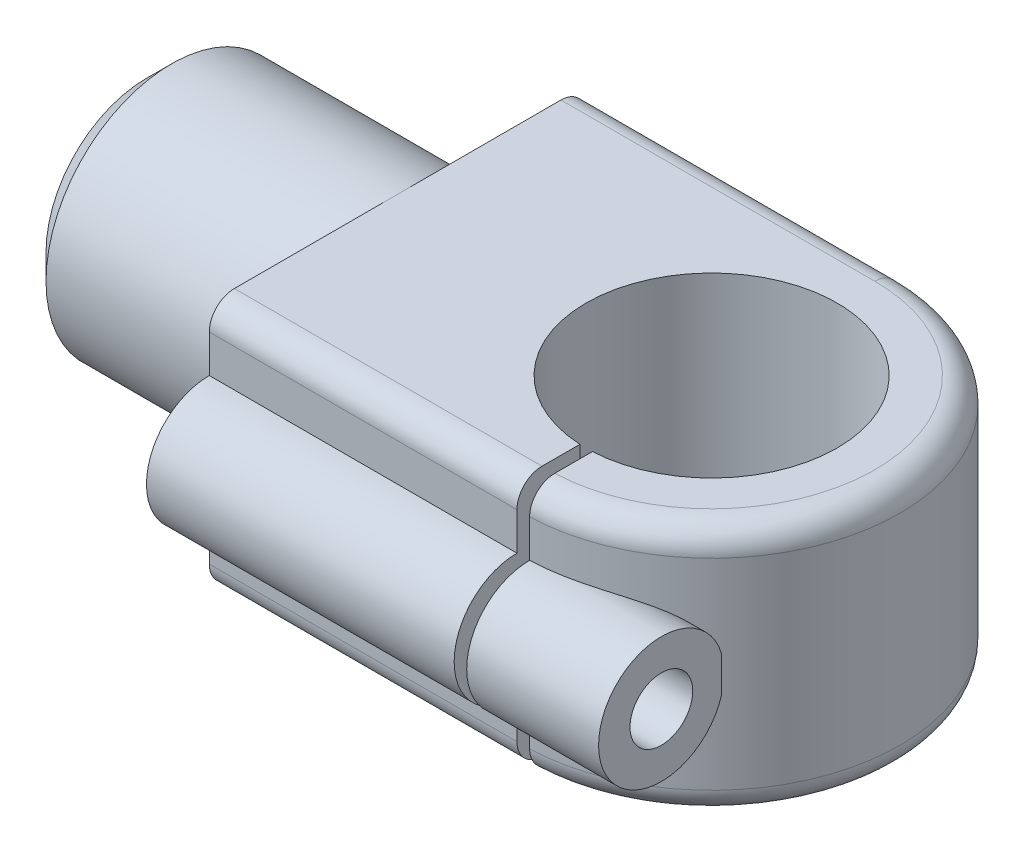
ISO-10303-21;
HEADER;
FILE_DESCRIPTION(('STEP AP214'),'2;1');
FILE_NAME('part.step','',(''),(''),'','','');
FILE_SCHEMA(('AUTOMOTIVE_DESIGN { 1 0 10303 214 1 1 1 1 }'));
ENDSEC;
DATA;
#1=APPLICATION_CONTEXT('core data for automotive mechanical design processes');
#2=APPLICATION_PROTOCOL_DEFINITION('international standard','automotive_design',2000,#1);
#3=PRODUCT_CONTEXT('',#1,'mechanical');
#4=PRODUCT('Part','Part','',(#3));
#5=PRODUCT_RELATED_PRODUCT_CATEGORY('part','',(#4));
#6=PRODUCT_DEFINITION_FORMATION('','',#4);
#7=PRODUCT_DEFINITION_CONTEXT('part definition',#1,'design');
#8=PRODUCT_DEFINITION('design','',#6,#7);
#9=PRODUCT_DEFINITION_SHAPE('','',#8);
#10=(LENGTH_UNIT() NAMED_UNIT(*) SI_UNIT(.MILLI.,.METRE.));
#11=(NAMED_UNIT(*) PLANE_ANGLE_UNIT() SI_UNIT($,.RADIAN.));
#12=(NAMED_UNIT(*) SI_UNIT($,.STERADIAN.) SOLID_ANGLE_UNIT());
#13=UNCERTAINTY_MEASURE_WITH_UNIT(LENGTH_MEASURE(1.E-05),#10,'distance_accuracy_value','');
#14=(GEOMETRIC_REPRESENTATION_CONTEXT(3) GLOBAL_UNCERTAINTY_ASSIGNED_CONTEXT((#13)) GLOBAL_UNIT_ASSIGNED_CONTEXT((#10,
#11,#12)) REPRESENTATION_CONTEXT('',''));
#15=CARTESIAN_POINT('',(0.,0.,0.));
#16=DIRECTION('',(0.,0.,1.));
#17=DIRECTION('',(1.,0.,0.));
#18=AXIS2_PLACEMENT_3D('',#15,#16,#17);
#19=CARTESIAN_POINT('',(0.,20.,0.));
#20=DIRECTION('',(0.,1.,0.));
#21=DIRECTION('',(0.,0.,1.));
#22=AXIS2_PLACEMENT_3D('',#19,#20,#21);
#23=PLANE('',#22);
#24=DIRECTION('',(0.,0.,-1.));
#25=VECTOR('',#24,1.);
#26=CARTESIAN_POINT('',(-25.,20.,0.));
#27=LINE('',#26,#25);
#28=CARTESIAN_POINT('',(-25.,20.,0.));
#29=VERTEX_POINT('',#28);
#30=CARTESIAN_POINT('',(-25.,20.,-13.));
#31=VERTEX_POINT('',#30);
#32=EDGE_CURVE('E193',#29,#31,#27,.T.);
#33=ORIENTED_EDGE('',*,*,#32,.F.);
#34=DIRECTION('',(0.,0.,-1.));
#35=VECTOR('',#34,1.);
#36=CARTESIAN_POINT('',(-25.,20.,0.));
#37=LINE('',#36,#35);
#38=CARTESIAN_POINT('',(-25.,20.,13.));
#39=VERTEX_POINT('',#38);
#40=EDGE_CURVE('E177',#39,#29,#37,.T.);
#41=ORIENTED_EDGE('',*,*,#40,.F.);
#42=DIRECTION('',(1.,0.,0.));
#43=VECTOR('',#42,1.);
#44=CARTESIAN_POINT('',(-0.5,20.,13.));
#45=LINE('',#44,#43);
#46=CARTESIAN_POINT('',(-0.5,20.,13.));
#47=VERTEX_POINT('',#46);
#48=EDGE_CURVE('E340',#39,#47,#45,.T.);
#49=ORIENTED_EDGE('',*,*,#48,.T.);
#50=DIRECTION('',(0.,0.,-1.));
#51=VECTOR('',#50,1.);
#52=CARTESIAN_POINT('',(-0.5,20.,0.));
#53=LINE('',#52,#51);
#54=CARTESIAN_POINT('',(-0.5,20.,9.98749217771909));
#55=VERTEX_POINT('',#54);
#56=EDGE_CURVE('E395',#47,#55,#53,.T.);
#57=ORIENTED_EDGE('',*,*,#56,.T.);
#58=CARTESIAN_POINT('',(0.,20.,0.));
#59=DIRECTION('',(0.,1.,0.));
#60=DIRECTION('',(0.,0.,1.));
#61=AXIS2_PLACEMENT_3D('',#58,#59,#60);
#62=CIRCLE('',#61,10.);
#63=CARTESIAN_POINT('',(0.5,20.,9.98749217771909));
#64=VERTEX_POINT('',#63);
#65=EDGE_CURVE('E396',#64,#55,#62,.T.);
#66=ORIENTED_EDGE('',*,*,#65,.F.);
#67=DIRECTION('',(0.,0.,-1.));
#68=VECTOR('',#67,1.);
#69=CARTESIAN_POINT('',(0.5,20.,0.));
#70=LINE('',#69,#68);
#71=CARTESIAN_POINT('',(0.5,20.,12.9903810567666));
#72=VERTEX_POINT('',#71);
#73=EDGE_CURVE('E397',#72,#64,#70,.T.);
#74=ORIENTED_EDGE('',*,*,#73,.F.);
#75=CARTESIAN_POINT('',(0.,20.,0.));
#76=DIRECTION('',(0.,1.,0.));
#77=DIRECTION('',(0.,0.,1.));
#78=AXIS2_PLACEMENT_3D('',#75,#76,#77);
#79=CIRCLE('',#78,13.);
#80=CARTESIAN_POINT('',(0.,20.,-13.));
#81=VERTEX_POINT('',#80);
#82=EDGE_CURVE('E335',#72,#81,#79,.T.);
#83=ORIENTED_EDGE('',*,*,#82,.T.);
#84=DIRECTION('',(-1.,0.,0.));
#85=VECTOR('',#84,1.);
#86=CARTESIAN_POINT('',(-30.,20.,-13.));
#87=LINE('',#86,#85);
#88=EDGE_CURVE('E203',#81,#31,#87,.T.);
#89=ORIENTED_EDGE('',*,*,#88,.T.);
#90=EDGE_LOOP('',(#33,#41,#49,#57,#66,#74,#83,#89));
#91=FACE_BOUND('',#90,.T.);
#92=ADVANCED_FACE('F50',(#91),#23,.T.);
#93=CARTESIAN_POINT('',(0.,0.,0.));
#94=DIRECTION('',(0.,1.,0.));
#95=DIRECTION('',(0.,0.,1.));
#96=AXIS2_PLACEMENT_3D('',#93,#94,#95);
#97=PLANE('',#96);
#98=DIRECTION('',(0.,0.,1.));
#99=VECTOR('',#98,1.);
#100=CARTESIAN_POINT('',(-25.,0.,0.));
#101=LINE('',#100,#99);
#102=CARTESIAN_POINT('',(-25.,0.,0.));
#103=VERTEX_POINT('',#102);
#104=CARTESIAN_POINT('',(-25.,0.,13.));
#105=VERTEX_POINT('',#104);
#106=EDGE_CURVE('E178',#103,#105,#101,.T.);
#107=ORIENTED_EDGE('',*,*,#106,.F.);
#108=DIRECTION('',(0.,0.,1.));
#109=VECTOR('',#108,1.);
#110=CARTESIAN_POINT('',(-25.,0.,0.));
#111=LINE('',#110,#109);
#112=CARTESIAN_POINT('',(-25.,0.,-13.));
#113=VERTEX_POINT('',#112);
#114=EDGE_CURVE('E198',#113,#103,#111,.T.);
#115=ORIENTED_EDGE('',*,*,#114,.F.);
#116=DIRECTION('',(-1.,0.,0.));
#117=VECTOR('',#116,1.);
#118=CARTESIAN_POINT('',(0.,0.,-13.));
#119=LINE('',#118,#117);
#120=CARTESIAN_POINT('',(0.,0.,-13.));
#121=VERTEX_POINT('',#120);
#122=EDGE_CURVE('E324',#113,#121,#119,.F.);
#123=ORIENTED_EDGE('',*,*,#122,.T.);
#124=CARTESIAN_POINT('',(0.,0.,0.));
#125=DIRECTION('',(0.,1.,0.));
#126=DIRECTION('',(0.,0.,1.));
#127=AXIS2_PLACEMENT_3D('',#124,#125,#126);
#128=CIRCLE('',#127,13.);
#129=CARTESIAN_POINT('',(0.5,0.,12.9903810567666));
#130=VERTEX_POINT('',#129);
#131=EDGE_CURVE('E320',#121,#130,#128,.F.);
#132=ORIENTED_EDGE('',*,*,#131,.T.);
#133=DIRECTION('',(0.,0.,-1.));
#134=VECTOR('',#133,1.);
#135=CARTESIAN_POINT('',(0.5,0.,0.));
#136=LINE('',#135,#134);
#137=CARTESIAN_POINT('',(0.5,0.,9.98749217771909));
#138=VERTEX_POINT('',#137);
#139=EDGE_CURVE('E416',#130,#138,#136,.T.);
#140=ORIENTED_EDGE('',*,*,#139,.T.);
#141=CARTESIAN_POINT('',(0.,0.,0.));
#142=DIRECTION('',(0.,1.,0.));
#143=DIRECTION('',(0.,0.,1.));
#144=AXIS2_PLACEMENT_3D('',#141,#142,#143);
#145=CIRCLE('',#144,10.);
#146=CARTESIAN_POINT('',(-0.5,0.,9.98749217771909));
#147=VERTEX_POINT('',#146);
#148=EDGE_CURVE('E421',#138,#147,#145,.T.);
#149=ORIENTED_EDGE('',*,*,#148,.T.);
#150=DIRECTION('',(0.,0.,-1.));
#151=VECTOR('',#150,1.);
#152=CARTESIAN_POINT('',(-0.5,0.,0.));
#153=LINE('',#152,#151);
#154=CARTESIAN_POINT('',(-0.5,0.,13.));
#155=VERTEX_POINT('',#154);
#156=EDGE_CURVE('E404',#155,#147,#153,.T.);
#157=ORIENTED_EDGE('',*,*,#156,.F.);
#158=DIRECTION('',(1.,0.,0.));
#159=VECTOR('',#158,1.);
#160=CARTESIAN_POINT('',(0.,0.,13.));
#161=LINE('',#160,#159);
#162=EDGE_CURVE('E327',#155,#105,#161,.F.);
#163=ORIENTED_EDGE('',*,*,#162,.T.);
#164=EDGE_LOOP('',(#107,#115,#123,#132,#140,#149,#157,#163));
#165=FACE_BOUND('',#164,.T.);
#166=ADVANCED_FACE('F270',(#165),#97,.F.);
#167=CARTESIAN_POINT('',(11.,10.,15.));
#168=DIRECTION('',(-1.,0.,0.));
#169=DIRECTION('',(0.,0.,1.));
#170=AXIS2_PLACEMENT_3D('',#167,#168,#169);
#171=CYLINDRICAL_SURFACE('',#170,5.);
#172=DIRECTION('',(-1.,0.,0.));
#173=VECTOR('',#172,1.);
#174=CARTESIAN_POINT('',(11.,15.,15.));
#175=LINE('',#174,#173);
#176=CARTESIAN_POINT('',(-25.,15.,15.));
#177=VERTEX_POINT('',#176);
#178=CARTESIAN_POINT('',(-0.5,15.,15.));
#179=VERTEX_POINT('',#178);
#180=EDGE_CURVE('E230',#177,#179,#175,.F.);
#181=ORIENTED_EDGE('',*,*,#180,.F.);
#182=CARTESIAN_POINT('',(-25.,10.,15.));
#183=DIRECTION('',(-1.,0.,0.));
#184=DIRECTION('',(0.,0.,1.));
#185=AXIS2_PLACEMENT_3D('',#182,#183,#184);
#186=CIRCLE('',#185,5.);
#187=CARTESIAN_POINT('',(-25.,5.,15.));
#188=VERTEX_POINT('',#187);
#189=EDGE_CURVE('E503',#188,#177,#186,.T.);
#190=ORIENTED_EDGE('',*,*,#189,.F.);
#191=DIRECTION('',(-1.,0.,0.));
#192=VECTOR('',#191,1.);
#193=CARTESIAN_POINT('',(11.,5.,15.));
#194=LINE('',#193,#192);
#195=CARTESIAN_POINT('',(-0.5,5.,15.));
#196=VERTEX_POINT('',#195);
#197=EDGE_CURVE('E227',#196,#188,#194,.T.);
#198=ORIENTED_EDGE('',*,*,#197,.F.);
#199=CARTESIAN_POINT('',(-0.5,10.,15.));
#200=DIRECTION('',(-1.,0.,0.));
#201=DIRECTION('',(0.,0.,1.));
#202=AXIS2_PLACEMENT_3D('',#199,#200,#201);
#203=CIRCLE('',#202,5.);
#204=EDGE_CURVE('E311',#179,#196,#203,.F.);
#205=ORIENTED_EDGE('',*,*,#204,.F.);
#206=EDGE_LOOP('',(#181,#190,#198,#205));
#207=FACE_BOUND('',#206,.T.);
#208=ADVANCED_FACE('F265',(#207),#171,.T.);
#209=CARTESIAN_POINT('',(0.,20.,15.));
#210=DIRECTION('',(0.,0.,-1.));
#211=DIRECTION('',(-1.,0.,0.));
#212=AXIS2_PLACEMENT_3D('',#209,#210,#211);
#213=PLANE('',#212);
#214=DIRECTION('',(0.,1.,0.));
#215=VECTOR('',#214,1.);
#216=CARTESIAN_POINT('',(-25.,0.,15.));
#217=LINE('',#216,#215);
#218=CARTESIAN_POINT('',(-25.,2.,15.));
#219=VERTEX_POINT('',#218);
#220=EDGE_CURVE('E504',#219,#188,#217,.T.);
#221=ORIENTED_EDGE('',*,*,#220,.F.);
#222=DIRECTION('',(1.,0.,0.));
#223=VECTOR('',#222,1.);
#224=CARTESIAN_POINT('',(0.,2.,15.));
#225=LINE('',#224,#223);
#226=CARTESIAN_POINT('',(-0.5,2.,15.));
#227=VERTEX_POINT('',#226);
#228=EDGE_CURVE('E348',#219,#227,#225,.T.);
#229=ORIENTED_EDGE('',*,*,#228,.T.);
#230=DIRECTION('',(0.,-1.,0.));
#231=VECTOR('',#230,1.);
#232=CARTESIAN_POINT('',(-0.5,20.,15.));
#233=LINE('',#232,#231);
#234=EDGE_CURVE('E406',#196,#227,#233,.T.);
#235=ORIENTED_EDGE('',*,*,#234,.F.);
#236=ORIENTED_EDGE('',*,*,#197,.T.);
#237=EDGE_LOOP('',(#221,#229,#235,#236));
#238=FACE_BOUND('',#237,.T.);
#239=ADVANCED_FACE('F276',(#238),#213,.F.);
#240=DIRECTION('',(0.,1.,0.));
#241=VECTOR('',#240,1.);
#242=CARTESIAN_POINT('',(-25.,0.,15.));
#243=LINE('',#242,#241);
#244=CARTESIAN_POINT('',(-25.,18.,15.));
#245=VERTEX_POINT('',#244);
#246=EDGE_CURVE('E499',#177,#245,#243,.T.);
#247=ORIENTED_EDGE('',*,*,#246,.F.);
#248=ORIENTED_EDGE('',*,*,#180,.T.);
#249=CARTESIAN_POINT('',(-0.5,18.,15.));
#250=VERTEX_POINT('',#249);
#251=EDGE_CURVE('E426',#250,#179,#233,.T.);
#252=ORIENTED_EDGE('',*,*,#251,.F.);
#253=DIRECTION('',(1.,0.,0.));
#254=VECTOR('',#253,1.);
#255=CARTESIAN_POINT('',(-30.,18.,15.));
#256=LINE('',#255,#254);
#257=EDGE_CURVE('E347',#250,#245,#256,.F.);
#258=ORIENTED_EDGE('',*,*,#257,.T.);
#259=EDGE_LOOP('',(#247,#248,#252,#258));
#260=FACE_BOUND('',#259,.T.);
#261=ADVANCED_FACE('F283',(#260),#213,.F.);
#262=CARTESIAN_POINT('',(-30.,10.,15.));
#263=DIRECTION('',(1.,0.,0.));
#264=DIRECTION('',(0.,0.,-1.));
#265=AXIS2_PLACEMENT_3D('',#262,#263,#264);
#266=CYLINDRICAL_SURFACE('',#265,2.5);
#267=CARTESIAN_POINT('',(-0.5,10.,15.));
#268=DIRECTION('',(-1.,0.,0.));
#269=DIRECTION('',(0.,0.,1.));
#270=AXIS2_PLACEMENT_3D('',#267,#268,#269);
#271=CIRCLE('',#270,2.5);
#272=CARTESIAN_POINT('',(-0.5,10.,17.5));
#273=VERTEX_POINT('',#272);
#274=EDGE_CURVE('E212',#273,#273,#271,.T.);
#275=ORIENTED_EDGE('',*,*,#274,.F.);
#276=EDGE_LOOP('',(#275));
#277=FACE_BOUND('',#276,.T.);
#278=CARTESIAN_POINT('',(-25.,10.,15.));
#279=DIRECTION('',(-1.,0.,0.));
#280=DIRECTION('',(0.,0.,1.));
#281=AXIS2_PLACEMENT_3D('',#278,#279,#280);
#282=CIRCLE('',#281,2.5);
#283=CARTESIAN_POINT('',(-25.,10.,17.5));
#284=VERTEX_POINT('',#283);
#285=EDGE_CURVE('E189',#284,#284,#282,.F.);
#286=ORIENTED_EDGE('',*,*,#285,.F.);
#287=EDGE_LOOP('',(#286));
#288=FACE_BOUND('',#287,.T.);
#289=ADVANCED_FACE('F385',(#277,#288),#266,.F.);
#290=CARTESIAN_POINT('',(0.,18.,13.));
#291=DIRECTION('',(-1.,0.,0.));
#292=DIRECTION('',(0.,0.,1.));
#293=AXIS2_PLACEMENT_3D('',#290,#291,#292);
#294=CYLINDRICAL_SURFACE('',#293,2.);
#295=ORIENTED_EDGE('',*,*,#48,.F.);
#296=CARTESIAN_POINT('',(-25.,18.,13.));
#297=DIRECTION('',(-1.,0.,0.));
#298=DIRECTION('',(0.,0.,1.));
#299=AXIS2_PLACEMENT_3D('',#296,#297,#298);
#300=CIRCLE('',#299,2.);
#301=EDGE_CURVE('E184',#245,#39,#300,.T.);
#302=ORIENTED_EDGE('',*,*,#301,.F.);
#303=ORIENTED_EDGE('',*,*,#257,.F.);
#304=CARTESIAN_POINT('',(-0.5,18.,13.));
#305=DIRECTION('',(-1.,0.,0.));
#306=DIRECTION('',(0.,0.,1.));
#307=AXIS2_PLACEMENT_3D('',#304,#305,#306);
#308=CIRCLE('',#307,2.);
#309=EDGE_CURVE('E343',#47,#250,#308,.F.);
#310=ORIENTED_EDGE('',*,*,#309,.F.);
#311=EDGE_LOOP('',(#295,#302,#303,#310));
#312=FACE_BOUND('',#311,.T.);
#313=ADVANCED_FACE('F293',(#312),#294,.T.);
#314=CARTESIAN_POINT('',(0.,2.,13.));
#315=DIRECTION('',(1.,0.,0.));
#316=DIRECTION('',(0.,0.,-1.));
#317=AXIS2_PLACEMENT_3D('',#314,#315,#316);
#318=CYLINDRICAL_SURFACE('',#317,2.);
#319=ORIENTED_EDGE('',*,*,#228,.F.);
#320=CARTESIAN_POINT('',(-25.,2.,13.));
#321=DIRECTION('',(-1.,0.,0.));
#322=DIRECTION('',(0.,0.,1.));
#323=AXIS2_PLACEMENT_3D('',#320,#321,#322);
#324=CIRCLE('',#323,2.);
#325=EDGE_CURVE('E510',#105,#219,#324,.T.);
#326=ORIENTED_EDGE('',*,*,#325,.F.);
#327=ORIENTED_EDGE('',*,*,#162,.F.);
#328=CARTESIAN_POINT('',(-0.5,2.,13.));
#329=DIRECTION('',(-1.,0.,0.));
#330=DIRECTION('',(0.,0.,1.));
#331=AXIS2_PLACEMENT_3D('',#328,#329,#330);
#332=CIRCLE('',#331,2.);
#333=EDGE_CURVE('E337',#227,#155,#332,.F.);
#334=ORIENTED_EDGE('',*,*,#333,.F.);
#335=EDGE_LOOP('',(#319,#326,#327,#334));
#336=FACE_BOUND('',#335,.T.);
#337=ADVANCED_FACE('F286',(#336),#318,.T.);
#338=CARTESIAN_POINT('',(0.,20.,-15.));
#339=DIRECTION('',(0.,0.,1.));
#340=DIRECTION('',(1.,0.,0.));
#341=AXIS2_PLACEMENT_3D('',#338,#339,#340);
#342=PLANE('',#341);
#343=DIRECTION('',(0.,-1.,0.));
#344=VECTOR('',#343,1.);
#345=CARTESIAN_POINT('',(-25.,0.,-15.));
#346=LINE('',#345,#344);
#347=CARTESIAN_POINT('',(-25.,18.,-15.));
#348=VERTEX_POINT('',#347);
#349=CARTESIAN_POINT('',(-25.,2.,-15.));
#350=VERTEX_POINT('',#349);
#351=EDGE_CURVE('E299',#348,#350,#346,.T.);
#352=ORIENTED_EDGE('',*,*,#351,.F.);
#353=DIRECTION('',(-1.,0.,0.));
#354=VECTOR('',#353,1.);
#355=CARTESIAN_POINT('',(0.,18.,-15.));
#356=LINE('',#355,#354);
#357=CARTESIAN_POINT('',(0.,18.,-15.));
#358=VERTEX_POINT('',#357);
#359=EDGE_CURVE('E305',#348,#358,#356,.F.);
#360=ORIENTED_EDGE('',*,*,#359,.T.);
#361=DIRECTION('',(0.,-1.,0.));
#362=VECTOR('',#361,1.);
#363=CARTESIAN_POINT('',(0.,20.,-15.));
#364=LINE('',#363,#362);
#365=CARTESIAN_POINT('',(0.,2.,-15.));
#366=VERTEX_POINT('',#365);
#367=EDGE_CURVE('E429',#358,#366,#364,.T.);
#368=ORIENTED_EDGE('',*,*,#367,.T.);
#369=DIRECTION('',(-1.,0.,0.));
#370=VECTOR('',#369,1.);
#371=CARTESIAN_POINT('',(0.,2.,-15.));
#372=LINE('',#371,#370);
#373=EDGE_CURVE('E302',#366,#350,#372,.T.);
#374=ORIENTED_EDGE('',*,*,#373,.T.);
#375=EDGE_LOOP('',(#352,#360,#368,#374));
#376=FACE_BOUND('',#375,.T.);
#377=ADVANCED_FACE('F281',(#376),#342,.F.);
#378=CARTESIAN_POINT('',(0.,2.,-13.));
#379=DIRECTION('',(-1.,0.,0.));
#380=DIRECTION('',(0.,0.,1.));
#381=AXIS2_PLACEMENT_3D('',#378,#379,#380);
#382=CYLINDRICAL_SURFACE('',#381,2.);
#383=ORIENTED_EDGE('',*,*,#122,.F.);
#384=CARTESIAN_POINT('',(-25.,2.,-13.));
#385=DIRECTION('',(-1.,0.,0.));
#386=DIRECTION('',(0.,0.,1.));
#387=AXIS2_PLACEMENT_3D('',#384,#385,#386);
#388=CIRCLE('',#387,2.);
#389=EDGE_CURVE('E307',#350,#113,#388,.T.);
#390=ORIENTED_EDGE('',*,*,#389,.F.);
#391=ORIENTED_EDGE('',*,*,#373,.F.);
#392=CARTESIAN_POINT('',(0.,2.,-13.));
#393=DIRECTION('',(-1.,0.,0.));
#394=DIRECTION('',(0.,-1.,0.));
#395=AXIS2_PLACEMENT_3D('',#392,#393,#394);
#396=CIRCLE('',#395,2.);
#397=EDGE_CURVE('E214',#366,#121,#396,.T.);
#398=ORIENTED_EDGE('',*,*,#397,.T.);
#399=EDGE_LOOP('',(#383,#390,#391,#398));
#400=FACE_BOUND('',#399,.T.);
#401=ADVANCED_FACE('F282',(#400),#382,.T.);
#402=CARTESIAN_POINT('',(0.,18.,-13.));
#403=DIRECTION('',(1.,0.,0.));
#404=DIRECTION('',(0.,0.,-1.));
#405=AXIS2_PLACEMENT_3D('',#402,#403,#404);
#406=CYLINDRICAL_SURFACE('',#405,2.);
#407=ORIENTED_EDGE('',*,*,#359,.F.);
#408=CARTESIAN_POINT('',(-25.,18.,-13.));
#409=DIRECTION('',(-1.,0.,0.));
#410=DIRECTION('',(0.,0.,1.));
#411=AXIS2_PLACEMENT_3D('',#408,#409,#410);
#412=CIRCLE('',#411,2.);
#413=EDGE_CURVE('E201',#31,#348,#412,.T.);
#414=ORIENTED_EDGE('',*,*,#413,.F.);
#415=ORIENTED_EDGE('',*,*,#88,.F.);
#416=CARTESIAN_POINT('',(0.,18.,-13.));
#417=DIRECTION('',(-1.,0.,0.));
#418=DIRECTION('',(0.,0.,1.));
#419=AXIS2_PLACEMENT_3D('',#416,#417,#418);
#420=CIRCLE('',#419,2.);
#421=EDGE_CURVE('E206',#81,#358,#420,.T.);
#422=ORIENTED_EDGE('',*,*,#421,.T.);
#423=EDGE_LOOP('',(#407,#414,#415,#422));
#424=FACE_BOUND('',#423,.T.);
#425=ADVANCED_FACE('F295',(#424),#406,.T.);
#426=CARTESIAN_POINT('',(0.5,20.,0.));
#427=DIRECTION('',(-1.,0.,0.));
#428=DIRECTION('',(0.,0.,1.));
#429=AXIS2_PLACEMENT_3D('',#426,#427,#428);
#430=PLANE('',#429);
#431=CARTESIAN_POINT('',(0.5,10.,15.));
#432=DIRECTION('',(-1.,0.,0.));
#433=DIRECTION('',(0.,0.,1.));
#434=AXIS2_PLACEMENT_3D('',#431,#432,#433);
#435=CIRCLE('',#434,2.5);
#436=CARTESIAN_POINT('',(0.5,10.,17.5));
#437=VERTEX_POINT('',#436);
#438=EDGE_CURVE('E218',#437,#437,#435,.T.);
#439=ORIENTED_EDGE('',*,*,#438,.F.);
#440=EDGE_LOOP('',(#439));
#441=FACE_BOUND('',#440,.T.);
#442=ORIENTED_EDGE('',*,*,#139,.F.);
#443=CARTESIAN_POINT('',(0.5,0.,12.9903810567666));
#444=CARTESIAN_POINT('',(0.5,3.9474154008824E-07,13.0467150452053));
#445=CARTESIAN_POINT('',(0.5,0.00237810851266362,13.103022076195));
#446=CARTESIAN_POINT('',(0.5,0.0118641897622879,13.215233562011));
#447=CARTESIAN_POINT('',(0.5,0.0189723412082146,13.2711380351036));
#448=CARTESIAN_POINT('',(0.5,0.0473260310628624,13.4375517851217));
#449=CARTESIAN_POINT('',(0.5,0.0756009864726571,13.5469468675122));
#450=CARTESIAN_POINT('',(0.5,0.150116828889387,13.759434911907));
#451=CARTESIAN_POINT('',(0.5,0.196366540729273,13.8625247494893));
#452=CARTESIAN_POINT('',(0.5,0.305518473808404,14.0594686849897));
#453=CARTESIAN_POINT('',(0.5,0.36841763608513,14.1533244751162));
#454=CARTESIAN_POINT('',(0.5,0.5090593195644,14.329096210817));
#455=CARTESIAN_POINT('',(0.5,0.586795865286165,14.4110169396758));
#456=CARTESIAN_POINT('',(0.5,0.754945090825614,14.5606526498705));
#457=CARTESIAN_POINT('',(0.5,0.845360238454905,14.6283648591851));
#458=CARTESIAN_POINT('',(0.5,1.03623337964804,14.7476054138702));
#459=CARTESIAN_POINT('',(0.5,1.13668716525642,14.7991405030972));
#460=CARTESIAN_POINT('',(0.5,1.34480385558574,14.8845781561183));
#461=CARTESIAN_POINT('',(0.5,1.45246243486213,14.9184911941124));
#462=CARTESIAN_POINT('',(0.5,1.63398864538022,14.9592514641663));
#463=CARTESIAN_POINT('',(0.5,1.70671025517,14.9713989770526));
#464=CARTESIAN_POINT('',(0.5,1.85294436952205,14.9876043045346));
#465=CARTESIAN_POINT('',(0.5,1.92645560245249,14.9916735975551));
#466=CARTESIAN_POINT('',(0.5,2.,14.9916643505649));
#467=B_SPLINE_CURVE_WITH_KNOTS('',3,(#443,#444,#445,#446,#447,#448,#449,#450,#451,#452,#453,
#454,#455,#456,#457,#458,#459,#460,#461,#462,#463,#464,#465,#466),.UNSPECIFIED.,.F.,.F.,(4,2,2,
2,2,2,2,2,2,2,2,4),(0.,0.168898237005139,0.337788761189665,0.675020464450288,1.01241794356334,
1.34975347644329,1.6869534392658,2.02421912732002,2.36134403003656,2.69826832248159,
2.91903835864936,3.13949447525757),.UNSPECIFIED.);
#468=CARTESIAN_POINT('',(0.5,2.,14.9916643505649));
#469=VERTEX_POINT('',#468);
#470=EDGE_CURVE('E61',#130,#469,#467,.T.);
#471=ORIENTED_EDGE('',*,*,#470,.T.);
#472=DIRECTION('',(0.,-1.,0.));
#473=VECTOR('',#472,1.);
#474=CARTESIAN_POINT('',(0.5,20.,14.9916643505649));
#475=LINE('',#474,#473);
#476=CARTESIAN_POINT('',(0.5,5.00000694830998,14.9916643505649));
#477=VERTEX_POINT('',#476);
#478=EDGE_CURVE('E433',#477,#469,#475,.T.);
#479=ORIENTED_EDGE('',*,*,#478,.F.);
#480=CARTESIAN_POINT('',(0.5,10.,15.));
#481=DIRECTION('',(1.,0.,0.));
#482=DIRECTION('',(0.,0.,-1.));
#483=AXIS2_PLACEMENT_3D('',#480,#481,#482);
#484=CIRCLE('',#483,5.);
#485=CARTESIAN_POINT('',(0.5,14.99999305169,14.9916643505649));
#486=VERTEX_POINT('',#485);
#487=EDGE_CURVE('E317',#477,#486,#484,.F.);
#488=ORIENTED_EDGE('',*,*,#487,.T.);
#489=CARTESIAN_POINT('',(0.5,18.,14.9916643505649));
#490=VERTEX_POINT('',#489);
#491=EDGE_CURVE('E432',#490,#486,#475,.T.);
#492=ORIENTED_EDGE('',*,*,#491,.F.);
#493=CARTESIAN_POINT('',(0.5,18.,14.9916643505649));
#494=CARTESIAN_POINT('',(0.5,18.0562458452927,14.9916639907305));
#495=CARTESIAN_POINT('',(0.5,18.1124647375663,14.9892888442767));
#496=CARTESIAN_POINT('',(0.5,18.2245000733079,14.9798135164011));
#497=CARTESIAN_POINT('',(0.5,18.2803165363377,14.972713566235));
#498=CARTESIAN_POINT('',(0.5,18.446463335016,14.9443944045545));
#499=CARTESIAN_POINT('',(0.5,18.5556804990266,14.9161556921597));
#500=CARTESIAN_POINT('',(0.5,18.7678202509978,14.8417448931838));
#501=CARTESIAN_POINT('',(0.5,18.8707398204714,14.7955642836472));
#502=CARTESIAN_POINT('',(0.5,19.0673647936057,14.6865882800202));
#503=CARTESIAN_POINT('',(0.5,19.161071780253,14.6237957472038));
#504=CARTESIAN_POINT('',(0.5,19.3366358835915,14.4833643720356));
#505=CARTESIAN_POINT('',(0.5,19.4184904393927,14.4057223296166));
#506=CARTESIAN_POINT('',(0.5,19.5680285447651,14.2377863166749));
#507=CARTESIAN_POINT('',(0.5,19.6357093140392,14.147489869681));
#508=CARTESIAN_POINT('',(0.5,19.7550060054429,13.9567638848156));
#509=CARTESIAN_POINT('',(0.5,19.8066101889012,13.8563270132114));
#510=CARTESIAN_POINT('',(0.5,19.892209745537,13.6482382207818));
#511=CARTESIAN_POINT('',(0.5,19.9262152415467,13.5405904880104));
#512=CARTESIAN_POINT('',(0.5,19.9672507114245,13.358639679444));
#513=CARTESIAN_POINT('',(0.5,19.9795244441603,13.2854760528088));
#514=CARTESIAN_POINT('',(0.5,19.9958980361735,13.1383454462529));
#515=CARTESIAN_POINT('',(0.5,20.0000094992786,13.0643797573145));
#516=CARTESIAN_POINT('',(0.5,20.,12.9903810567666));
#517=B_SPLINE_CURVE_WITH_KNOTS('',3,(#493,#494,#495,#496,#497,#498,#499,#500,#501,#502,#503,
#504,#505,#506,#507,#508,#509,#510,#511,#512,#513,#514,#515,#516),.UNSPECIFIED.,.F.,.F.,(4,2,2,
2,2,2,2,2,2,2,2,4),(0.,0.168633868792142,0.337259484403116,0.67394969371288,1.01080003721426,
1.34759239860703,1.68445742064833,2.02138845958609,2.35856494259508,2.69554726423919,
2.9176809505185,3.13949861536405),.UNSPECIFIED.);
#518=EDGE_CURVE('E358',#490,#72,#517,.T.);
#519=ORIENTED_EDGE('',*,*,#518,.T.);
#520=ORIENTED_EDGE('',*,*,#73,.T.);
#521=DIRECTION('',(0.,-1.,0.));
#522=VECTOR('',#521,1.);
#523=CARTESIAN_POINT('',(0.5,20.,9.98749217771909));
#524=LINE('',#523,#522);
#525=EDGE_CURVE('E409',#64,#138,#524,.T.);
#526=ORIENTED_EDGE('',*,*,#525,.T.);
#527=EDGE_LOOP('',(#442,#471,#479,#488,#492,#519,#520,#526));
#528=FACE_BOUND('',#527,.T.);
#529=ADVANCED_FACE('F375',(#441,#528),#430,.T.);
#530=CARTESIAN_POINT('',(0.,20.,0.));
#531=DIRECTION('',(0.,-1.,0.));
#532=DIRECTION('',(0.,0.,-1.));
#533=AXIS2_PLACEMENT_3D('',#530,#531,#532);
#534=CYLINDRICAL_SURFACE('',#533,15.);
#535=ORIENTED_EDGE('',*,*,#478,.T.);
#536=CARTESIAN_POINT('',(0.,2.,0.));
#537=DIRECTION('',(0.,1.,0.));
#538=DIRECTION('',(0.,0.,1.));
#539=AXIS2_PLACEMENT_3D('',#536,#537,#538);
#540=CIRCLE('',#539,15.);
#541=EDGE_CURVE('E352',#469,#366,#540,.T.);
#542=ORIENTED_EDGE('',*,*,#541,.T.);
#543=ORIENTED_EDGE('',*,*,#367,.F.);
#544=CARTESIAN_POINT('',(0.,18.,0.));
#545=DIRECTION('',(0.,1.,0.));
#546=DIRECTION('',(0.,0.,1.));
#547=AXIS2_PLACEMENT_3D('',#544,#545,#546);
#548=CIRCLE('',#547,15.);
#549=EDGE_CURVE('E72',#358,#490,#548,.F.);
#550=ORIENTED_EDGE('',*,*,#549,.T.);
#551=ORIENTED_EDGE('',*,*,#491,.T.);
#552=CARTESIAN_POINT('',(0.499999999999998,14.99999305169,14.9916643505649));
#553=CARTESIAN_POINT('',(0.709016176793523,14.9999570179221,14.9846960287137));
#554=CARTESIAN_POINT('',(0.917886394684518,14.9999471171306,14.9733510948819));
#555=CARTESIAN_POINT('',(1.33497382201988,14.9996940938068,14.9419396582291));
#556=CARTESIAN_POINT('',(1.54319101897098,14.9994509668395,14.9218729895613));
#557=CARTESIAN_POINT('',(1.9588562142638,14.9984453713524,14.8730202852095));
#558=CARTESIAN_POINT('',(2.16630296749293,14.9976822709062,14.844223663634));
#559=CARTESIAN_POINT('',(2.57980178239071,14.9951783835352,14.7779722324026));
#560=CARTESIAN_POINT('',(2.78585385810368,14.9934376064704,14.7405175100673));
#561=CARTESIAN_POINT('',(3.19819516434935,14.9883731536167,14.6566109459529));
#562=CARTESIAN_POINT('',(3.40446709098063,14.985034198444,14.6100748808715));
#563=CARTESIAN_POINT('',(3.81481113810398,14.9760302908913,14.5083389126559));
#564=CARTESIAN_POINT('',(4.01888329159912,14.9703653734574,14.4531391396967));
#565=CARTESIAN_POINT('',(4.42427238311351,14.9558397156679,14.3342386894659));
#566=CARTESIAN_POINT('',(4.62559113995534,14.9469812024119,14.2705439557314));
#567=CARTESIAN_POINT('',(5.02513455266006,14.9250534449839,14.1347987390139));
#568=CARTESIAN_POINT('',(5.22335957805687,14.9119847078051,14.0627492627735));
#569=CARTESIAN_POINT('',(5.65405436948396,14.877444671145,13.8958541208507));
#570=CARTESIAN_POINT('',(5.88577329280607,14.8548403589024,13.799289776119));
#571=CARTESIAN_POINT('',(6.34312287736273,14.7997408708904,13.5951275102535));
#572=CARTESIAN_POINT('',(6.56875358722205,14.7672457741414,13.4875296772739));
#573=CARTESIAN_POINT('',(7.01191480126644,14.6899133231455,13.2625254057557));
#574=CARTESIAN_POINT('',(7.2294710935807,14.64511995351,13.1451549420483));
#575=CARTESIAN_POINT('',(7.65575921460111,14.5402661904725,12.901532346789));
#576=CARTESIAN_POINT('',(7.86449399259669,14.4802109474141,12.7752832218465));
#577=CARTESIAN_POINT('',(8.21239614868667,14.361730623622,12.5533258163752));
#578=CARTESIAN_POINT('',(8.3542214976592,14.307858889113,12.4593467048967));
#579=CARTESIAN_POINT('',(8.6316130328255,14.1896467718256,12.2688037579691));
#580=CARTESIAN_POINT('',(8.76718094588151,14.1253092997167,12.1722406473872));
#581=CARTESIAN_POINT('',(9.03108644937174,13.9850113374701,11.9777423288579));
#582=CARTESIAN_POINT('',(9.15942721054837,13.9090559996162,11.8798077465345));
#583=CARTESIAN_POINT('',(9.40777696362126,13.7445078119889,11.6841250559839));
#584=CARTESIAN_POINT('',(9.52778837516228,13.6559186553294,11.5863769016924));
#585=CARTESIAN_POINT('',(9.81828557879378,13.415481458649,11.3425417167022));
#586=CARTESIAN_POINT('',(9.98266406219497,13.2546556643525,11.1976799460142));
#587=CARTESIAN_POINT('',(10.2089978522316,12.9891511711846,10.9903122397402));
#588=CARTESIAN_POINT('',(10.2810259377435,12.8966799743779,10.9228884000276));
#589=CARTESIAN_POINT('',(10.4178792804636,12.7036908774226,10.7924362078745));
#590=CARTESIAN_POINT('',(10.4827088610998,12.6031778702971,10.7294052256439));
#591=CARTESIAN_POINT('',(10.5920537224786,12.4159008305681,10.6213485052129));
#592=CARTESIAN_POINT('',(10.6380035770999,12.3305658260404,10.5752873034074));
#593=CARTESIAN_POINT('',(10.7247442635333,12.1552822369841,10.4873099890451));
#594=CARTESIAN_POINT('',(10.7655364988054,12.0653349169353,10.4453927495386));
#595=CARTESIAN_POINT('',(10.8419505586862,11.8806215129413,10.3660585040188));
#596=CARTESIAN_POINT('',(10.8775404208349,11.7858301047225,10.3286695412744));
#597=CARTESIAN_POINT('',(10.9430720355563,11.5923393369412,10.2592121376307));
#598=CARTESIAN_POINT('',(10.9730095855129,11.4936371350721,10.2271476577168));
#599=CARTESIAN_POINT('',(11.,11.393259062618,10.1980390271856));
#600=B_SPLINE_CURVE_WITH_KNOTS('',3,(#552,#553,#554,#555,#556,#557,#558,#559,#560,#561,#562,
#563,#564,#565,#566,#567,#568,#569,#570,#571,#572,#573,#574,#575,#576,#577,#578,#579,#580,#581,
#582,#583,#584,#585,#586,#587,#588,#589,#590,#591,#592,#593,#594,#595,#596,#597,#598,#599),
.UNSPECIFIED.,.F.,.F.,(4,2,2,2,2,2,2,2,2,2,2,2,2,2,2,2,2,2,2,2,2,2,2,4),(0.,0.627351182839175,
1.25471429550598,1.88284120880964,2.51096178747135,3.14521124727079,3.77945117817742,
4.41324966566169,5.04697185993519,5.80264759521503,6.55831729334522,7.31131878473383,
8.06406650135722,8.59907478034048,9.13393451955992,9.66855774359114,10.2030250058538,
11.0147156487105,11.4199831358448,11.8250058871594,12.146653328004,12.4682130548674,
12.7916720925342,13.1153706899558),.UNSPECIFIED.);
#601=CARTESIAN_POINT('',(11.,11.393259062618,10.1980390271856));
#602=VERTEX_POINT('',#601);
#603=EDGE_CURVE('E244',#486,#602,#600,.T.);
#604=ORIENTED_EDGE('',*,*,#603,.T.);
#605=DIRECTION('',(0.,-1.,0.));
#606=VECTOR('',#605,1.);
#607=CARTESIAN_POINT('',(11.,20.,10.1980390271856));
#608=LINE('',#607,#606);
#609=CARTESIAN_POINT('',(11.,8.60674093738201,10.1980390271856));
#610=VERTEX_POINT('',#609);
#611=EDGE_CURVE('E440',#610,#602,#608,.F.);
#612=ORIENTED_EDGE('',*,*,#611,.F.);
#613=CARTESIAN_POINT('',(11.,8.60674093738201,10.1980390271856));
#614=CARTESIAN_POINT('',(10.9681497892336,8.48826272321655,10.2323863539468));
#615=CARTESIAN_POINT('',(10.932190206325,8.37213914079519,10.2708589859221));
#616=CARTESIAN_POINT('',(10.8524541258747,8.1454851723718,10.3550778741438));
#617=CARTESIAN_POINT('',(10.8086857787056,8.03494910732818,10.4008165410863));
#618=CARTESIAN_POINT('',(10.7140727344312,7.82102380215299,10.4982472347182));
#619=CARTESIAN_POINT('',(10.6632917615689,7.71758152243639,10.5498849977407));
#620=CARTESIAN_POINT('',(10.554802369404,7.51731456320768,10.6584266153143));
#621=CARTESIAN_POINT('',(10.4970924009117,7.42049137121827,10.7153316468711));
#622=CARTESIAN_POINT('',(10.3147273225745,7.14127811918767,10.8919607390469));
#623=CARTESIAN_POINT('',(10.180377402778,6.96911664533216,11.018082642827));
#624=CARTESIAN_POINT('',(9.88946641976325,6.65284353287973,11.2799300277889));
#625=CARTESIAN_POINT('',(9.73285801474437,6.50879327525164,11.4156756611451));
#626=CARTESIAN_POINT('',(9.44132568279479,6.27901233707514,11.6571071263238));
#627=CARTESIAN_POINT('',(9.31027113223434,6.18759308986831,11.7621535470754));
#628=CARTESIAN_POINT('',(9.0389819072277,6.018960082979,11.9718918915287));
#629=CARTESIAN_POINT('',(8.89874324610567,5.94175254853555,12.076583640255));
#630=CARTESIAN_POINT('',(8.61023794467512,5.80013542434358,12.2839495590363));
#631=CARTESIAN_POINT('',(8.46196029366693,5.73574398213745,12.3866206852386));
#632=CARTESIAN_POINT('',(8.15863133954971,5.61842215863648,12.5884855965981));
#633=CARTESIAN_POINT('',(8.00357774300767,5.56549569453292,12.6876781835864));
#634=CARTESIAN_POINT('',(7.60029162671509,5.44317309345108,12.9351567808342));
#635=CARTESIAN_POINT('',(7.34794500720837,5.3808530367901,13.0802597443766));
#636=CARTESIAN_POINT('',(6.8320789283882,5.27534464189535,13.3569663084387));
#637=CARTESIAN_POINT('',(6.56855310817671,5.23216736020464,13.4885620737991));
#638=CARTESIAN_POINT('',(6.03168279694908,5.16039893841299,13.7370518981262));
#639=CARTESIAN_POINT('',(5.75830803182962,5.13185777353219,13.8538945724558));
#640=CARTESIAN_POINT('',(5.20437357040663,5.08573892950674,14.0713558665211));
#641=CARTESIAN_POINT('',(4.92381480367087,5.06815983932227,14.1719765731141));
#642=CARTESIAN_POINT('',(4.30495720531859,5.03820201646626,14.3732987468962));
#643=CARTESIAN_POINT('',(3.9654916205032,5.0273647023064,14.4706419993681));
#644=CARTESIAN_POINT('',(3.28032470688919,5.0121564536333,14.6411794097721));
#645=CARTESIAN_POINT('',(2.93462195234975,5.00778701704974,14.7143679705438));
#646=CARTESIAN_POINT('',(2.41442660409066,5.00369825792366,14.805444816789));
#647=CARTESIAN_POINT('',(2.24151677739333,5.00274510392516,14.8326072582638));
#648=CARTESIAN_POINT('',(1.89484202076948,5.00136059695042,14.8808667206037));
#649=CARTESIAN_POINT('',(1.72107708931378,5.00092924490766,14.9019637306181));
#650=CARTESIAN_POINT('',(1.37298565445021,5.0003505220372,14.9380559701495));
#651=CARTESIAN_POINT('',(1.19865939916693,5.00020303943225,14.9530535995406));
#652=CARTESIAN_POINT('',(0.849589806107389,5.00004198982749,14.976942644913));
#653=CARTESIAN_POINT('',(0.67484647041621,5.0000284221596,14.9858340913566));
#654=CARTESIAN_POINT('',(0.499999999999999,5.00000694830998,14.9916643505649));
#655=B_SPLINE_CURVE_WITH_KNOTS('',3,(#613,#614,#615,#616,#617,#618,#619,#620,#621,#622,#623,
#624,#625,#626,#627,#628,#629,#630,#631,#632,#633,#634,#635,#636,#637,#638,#639,#640,#641,#642,
#643,#644,#645,#646,#647,#648,#649,#650,#651,#652,#653,#654),.UNSPECIFIED.,.F.,.F.,(4,2,2,2,2,2,
2,2,2,2,2,2,2,2,2,2,2,2,2,2,4),(0.,0.381979245321956,0.763562108926435,1.14188137228921,
1.52028537859572,2.27346392738061,3.02826908255637,3.60117513507879,4.17433154685419,
4.74829386082581,5.32245196988107,6.21409795220185,7.10625826536677,8.0014449208999,
8.89651632407983,9.95546632784239,11.0146615410397,11.5396720904539,12.0646835790892,
12.5894882953806,13.1142903935326),.UNSPECIFIED.);
#656=EDGE_CURVE('E232',#610,#477,#655,.T.);
#657=ORIENTED_EDGE('',*,*,#656,.T.);
#658=EDGE_LOOP('',(#535,#542,#543,#550,#551,#604,#612,#657));
#659=FACE_BOUND('',#658,.T.);
#660=ADVANCED_FACE('F249',(#659),#534,.T.);
#661=CARTESIAN_POINT('',(-0.5,20.,0.));
#662=DIRECTION('',(-1.,0.,0.));
#663=DIRECTION('',(0.,0.,1.));
#664=AXIS2_PLACEMENT_3D('',#661,#662,#663);
#665=PLANE('',#664);
#666=ORIENTED_EDGE('',*,*,#274,.T.);
#667=EDGE_LOOP('',(#666));
#668=FACE_BOUND('',#667,.T.);
#669=ORIENTED_EDGE('',*,*,#56,.F.);
#670=ORIENTED_EDGE('',*,*,#309,.T.);
#671=ORIENTED_EDGE('',*,*,#251,.T.);
#672=ORIENTED_EDGE('',*,*,#204,.T.);
#673=ORIENTED_EDGE('',*,*,#234,.T.);
#674=ORIENTED_EDGE('',*,*,#333,.T.);
#675=ORIENTED_EDGE('',*,*,#156,.T.);
#676=DIRECTION('',(0.,-1.,0.));
#677=VECTOR('',#676,1.);
#678=CARTESIAN_POINT('',(-0.5,20.,9.98749217771909));
#679=LINE('',#678,#677);
#680=EDGE_CURVE('E405',#55,#147,#679,.T.);
#681=ORIENTED_EDGE('',*,*,#680,.F.);
#682=EDGE_LOOP('',(#669,#670,#671,#672,#673,#674,#675,#681));
#683=FACE_BOUND('',#682,.T.);
#684=ADVANCED_FACE('F273',(#668,#683),#665,.F.);
#685=CARTESIAN_POINT('',(0.,20.,0.));
#686=DIRECTION('',(0.,-1.,0.));
#687=DIRECTION('',(0.,0.,-1.));
#688=AXIS2_PLACEMENT_3D('',#685,#686,#687);
#689=CYLINDRICAL_SURFACE('',#688,10.);
#690=ORIENTED_EDGE('',*,*,#148,.F.);
#691=ORIENTED_EDGE('',*,*,#525,.F.);
#692=ORIENTED_EDGE('',*,*,#65,.T.);
#693=ORIENTED_EDGE('',*,*,#680,.T.);
#694=EDGE_LOOP('',(#690,#691,#692,#693));
#695=FACE_BOUND('',#694,.T.);
#696=ADVANCED_FACE('F271',(#695),#689,.F.);
#697=CARTESIAN_POINT('',(11.,10.,15.));
#698=DIRECTION('',(-1.,0.,0.));
#699=DIRECTION('',(0.,0.,1.));
#700=AXIS2_PLACEMENT_3D('',#697,#698,#699);
#701=PLANE('',#700);
#702=CARTESIAN_POINT('',(11.,10.,15.));
#703=DIRECTION('',(1.,0.,0.));
#704=DIRECTION('',(0.,0.,-1.));
#705=AXIS2_PLACEMENT_3D('',#702,#703,#704);
#706=CIRCLE('',#705,2.5);
#707=CARTESIAN_POINT('',(11.,10.,12.5));
#708=VERTEX_POINT('',#707);
#709=EDGE_CURVE('E209',#708,#708,#706,.T.);
#710=ORIENTED_EDGE('',*,*,#709,.F.);
#711=EDGE_LOOP('',(#710));
#712=FACE_BOUND('',#711,.T.);
#713=CARTESIAN_POINT('',(11.,10.,15.));
#714=DIRECTION('',(-1.,0.,0.));
#715=DIRECTION('',(0.,0.,1.));
#716=AXIS2_PLACEMENT_3D('',#713,#714,#715);
#717=CIRCLE('',#716,5.);
#718=EDGE_CURVE('E224',#610,#602,#717,.T.);
#719=ORIENTED_EDGE('',*,*,#718,.F.);
#720=ORIENTED_EDGE('',*,*,#611,.T.);
#721=EDGE_LOOP('',(#719,#720));
#722=FACE_BOUND('',#721,.T.);
#723=ADVANCED_FACE('F257',(#712,#722),#701,.F.);
#724=ORIENTED_EDGE('',*,*,#603,.F.);
#725=ORIENTED_EDGE('',*,*,#487,.F.);
#726=ORIENTED_EDGE('',*,*,#656,.F.);
#727=ORIENTED_EDGE('',*,*,#718,.T.);
#728=EDGE_LOOP('',(#724,#725,#726,#727));
#729=FACE_BOUND('',#728,.T.);
#730=ADVANCED_FACE('F255',(#729),#171,.T.);
#731=ORIENTED_EDGE('',*,*,#438,.T.);
#732=EDGE_LOOP('',(#731));
#733=FACE_BOUND('',#732,.T.);
#734=ORIENTED_EDGE('',*,*,#709,.T.);
#735=EDGE_LOOP('',(#734));
#736=FACE_BOUND('',#735,.T.);
#737=ADVANCED_FACE('F259',(#733,#736),#266,.F.);
#738=CARTESIAN_POINT('',(0.,2.,0.));
#739=DIRECTION('',(0.,1.,0.));
#740=DIRECTION('',(0.,0.,1.));
#741=AXIS2_PLACEMENT_3D('',#738,#739,#740);
#742=TOROIDAL_SURFACE('',#741,13.,2.);
#743=ORIENTED_EDGE('',*,*,#470,.F.);
#744=ORIENTED_EDGE('',*,*,#131,.F.);
#745=ORIENTED_EDGE('',*,*,#397,.F.);
#746=ORIENTED_EDGE('',*,*,#541,.F.);
#747=EDGE_LOOP('',(#743,#744,#745,#746));
#748=FACE_BOUND('',#747,.T.);
#749=ADVANCED_FACE('F377',(#748),#742,.T.);
#750=CARTESIAN_POINT('',(0.,18.,0.));
#751=DIRECTION('',(0.,1.,0.));
#752=DIRECTION('',(0.,0.,1.));
#753=AXIS2_PLACEMENT_3D('',#750,#751,#752);
#754=TOROIDAL_SURFACE('',#753,13.,2.);
#755=ORIENTED_EDGE('',*,*,#518,.F.);
#756=ORIENTED_EDGE('',*,*,#549,.F.);
#757=ORIENTED_EDGE('',*,*,#421,.F.);
#758=ORIENTED_EDGE('',*,*,#82,.F.);
#759=EDGE_LOOP('',(#755,#756,#757,#758));
#760=FACE_BOUND('',#759,.T.);
#761=ADVANCED_FACE('F372',(#760),#754,.T.);
#762=CARTESIAN_POINT('',(-45.,10.,0.));
#763=DIRECTION('',(1.,0.,0.));
#764=DIRECTION('',(0.,0.,-1.));
#765=AXIS2_PLACEMENT_3D('',#762,#763,#764);
#766=CYLINDRICAL_SURFACE('',#765,10.);
#767=CARTESIAN_POINT('',(-43.,10.,0.));
#768=DIRECTION('',(-1.,0.,0.));
#769=DIRECTION('',(0.,0.,1.));
#770=AXIS2_PLACEMENT_3D('',#767,#768,#769);
#771=CIRCLE('',#770,10.);
#772=CARTESIAN_POINT('',(-43.,10.,10.));
#773=VERTEX_POINT('',#772);
#774=EDGE_CURVE('E11',#773,#773,#771,.F.);
#775=ORIENTED_EDGE('',*,*,#774,.T.);
#776=EDGE_LOOP('',(#775));
#777=FACE_BOUND('',#776,.T.);
#778=CARTESIAN_POINT('',(-25.,10.,0.));
#779=DIRECTION('',(-1.,0.,0.));
#780=DIRECTION('',(0.,0.,1.));
#781=AXIS2_PLACEMENT_3D('',#778,#779,#780);
#782=CIRCLE('',#781,10.);
#783=EDGE_CURVE('E171',#29,#103,#782,.T.);
#784=ORIENTED_EDGE('',*,*,#783,.T.);
#785=CARTESIAN_POINT('',(-25.,10.,0.));
#786=DIRECTION('',(-1.,0.,0.));
#787=DIRECTION('',(0.,0.,1.));
#788=AXIS2_PLACEMENT_3D('',#785,#786,#787);
#789=CIRCLE('',#788,10.);
#790=EDGE_CURVE('E166',#29,#103,#789,.F.);
#791=ORIENTED_EDGE('',*,*,#790,.F.);
#792=EDGE_LOOP('',(#784,#791));
#793=FACE_BOUND('',#792,.T.);
#794=ADVANCED_FACE('F173',(#777,#793),#766,.T.);
#795=CARTESIAN_POINT('',(-45.,10.,0.));
#796=DIRECTION('',(-1.,0.,0.));
#797=DIRECTION('',(0.,0.,1.));
#798=AXIS2_PLACEMENT_3D('',#795,#796,#797);
#799=PLANE('',#798);
#800=CARTESIAN_POINT('',(-45.,10.,0.));
#801=DIRECTION('',(-1.,0.,0.));
#802=DIRECTION('',(0.,0.,1.));
#803=AXIS2_PLACEMENT_3D('',#800,#801,#802);
#804=CIRCLE('',#803,8.00000000000001);
#805=CARTESIAN_POINT('',(-45.,10.,8.00000000000001));
#806=VERTEX_POINT('',#805);
#807=EDGE_CURVE('E57',#806,#806,#804,.T.);
#808=ORIENTED_EDGE('',*,*,#807,.T.);
#809=EDGE_LOOP('',(#808));
#810=FACE_BOUND('',#809,.T.);
#811=ADVANCED_FACE('F457',(#810),#799,.T.);
#812=CARTESIAN_POINT('',(-25.,0.,0.));
#813=DIRECTION('',(-1.,0.,0.));
#814=DIRECTION('',(0.,0.,1.));
#815=AXIS2_PLACEMENT_3D('',#812,#813,#814);
#816=PLANE('',#815);
#817=ORIENTED_EDGE('',*,*,#351,.T.);
#818=ORIENTED_EDGE('',*,*,#389,.T.);
#819=ORIENTED_EDGE('',*,*,#114,.T.);
#820=ORIENTED_EDGE('',*,*,#783,.F.);
#821=ORIENTED_EDGE('',*,*,#32,.T.);
#822=ORIENTED_EDGE('',*,*,#413,.T.);
#823=EDGE_LOOP('',(#817,#818,#819,#820,#821,#822));
#824=FACE_BOUND('',#823,.T.);
#825=ADVANCED_FACE('F195',(#824),#816,.T.);
#826=CARTESIAN_POINT('',(-25.,0.,0.));
#827=DIRECTION('',(-1.,0.,0.));
#828=DIRECTION('',(0.,0.,1.));
#829=AXIS2_PLACEMENT_3D('',#826,#827,#828);
#830=PLANE('',#829);
#831=ORIENTED_EDGE('',*,*,#285,.T.);
#832=EDGE_LOOP('',(#831));
#833=FACE_BOUND('',#832,.T.);
#834=ORIENTED_EDGE('',*,*,#40,.T.);
#835=ORIENTED_EDGE('',*,*,#790,.T.);
#836=ORIENTED_EDGE('',*,*,#106,.T.);
#837=ORIENTED_EDGE('',*,*,#325,.T.);
#838=ORIENTED_EDGE('',*,*,#220,.T.);
#839=ORIENTED_EDGE('',*,*,#189,.T.);
#840=ORIENTED_EDGE('',*,*,#246,.T.);
#841=ORIENTED_EDGE('',*,*,#301,.T.);
#842=EDGE_LOOP('',(#834,#835,#836,#837,#838,#839,#840,#841));
#843=FACE_BOUND('',#842,.T.);
#844=ADVANCED_FACE('F185',(#833,#843),#830,.T.);
#845=CARTESIAN_POINT('',(-45.,10.,0.));
#846=DIRECTION('',(1.,0.,0.));
#847=DIRECTION('',(0.,0.,-1.));
#848=AXIS2_PLACEMENT_3D('',#845,#846,#847);
#849=CONICAL_SURFACE('',#848,8.00000000000001,0.785398163397446);
#850=ORIENTED_EDGE('',*,*,#774,.F.);
#851=EDGE_LOOP('',(#850));
#852=FACE_BOUND('',#851,.T.);
#853=ORIENTED_EDGE('',*,*,#807,.F.);
#854=EDGE_LOOP('',(#853));
#855=FACE_BOUND('',#854,.T.);
#856=ADVANCED_FACE('F47',(#852,#855),#849,.T.);
#857=CLOSED_SHELL('',(#92,#166,#208,#239,#261,#289,#313,#337,#377,#401,#425,#529,#660,#684,#696,
#723,#730,#737,#749,#761,#794,#811,#825,#844,#856));
#858=MANIFOLD_SOLID_BREP('B2',#857);
#859=ADVANCED_BREP_SHAPE_REPRESENTATION('',(#18,#858),#14);
#860=SHAPE_DEFINITION_REPRESENTATION(#9,#859);
ENDSEC;
END-ISO-10303-21;
